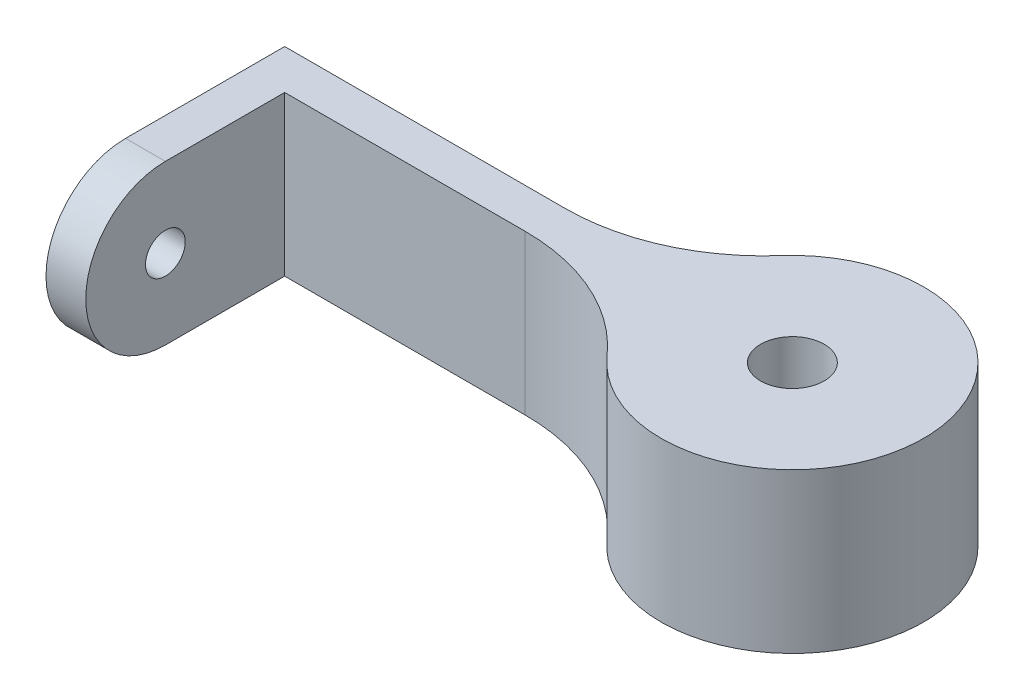
ISO-10303-21;
HEADER;
FILE_DESCRIPTION(('STEP AP214'),'2;1');
FILE_NAME('part.step','',(''),(''),'','','');
FILE_SCHEMA(('AUTOMOTIVE_DESIGN { 1 0 10303 214 1 1 1 1 }'));
ENDSEC;
DATA;
#1=APPLICATION_CONTEXT('core data for automotive mechanical design processes');
#2=APPLICATION_PROTOCOL_DEFINITION('international standard','automotive_design',2000,#1);
#3=PRODUCT_CONTEXT('',#1,'mechanical');
#4=PRODUCT('Part','Part','',(#3));
#5=PRODUCT_RELATED_PRODUCT_CATEGORY('part','',(#4));
#6=PRODUCT_DEFINITION_FORMATION('','',#4);
#7=PRODUCT_DEFINITION_CONTEXT('part definition',#1,'design');
#8=PRODUCT_DEFINITION('design','',#6,#7);
#9=PRODUCT_DEFINITION_SHAPE('','',#8);
#10=(LENGTH_UNIT() NAMED_UNIT(*) SI_UNIT(.MILLI.,.METRE.));
#11=(NAMED_UNIT(*) PLANE_ANGLE_UNIT() SI_UNIT($,.RADIAN.));
#12=(NAMED_UNIT(*) SI_UNIT($,.STERADIAN.) SOLID_ANGLE_UNIT());
#13=UNCERTAINTY_MEASURE_WITH_UNIT(LENGTH_MEASURE(1.E-05),#10,'distance_accuracy_value','');
#14=(GEOMETRIC_REPRESENTATION_CONTEXT(3) GLOBAL_UNCERTAINTY_ASSIGNED_CONTEXT((#13)) GLOBAL_UNIT_ASSIGNED_CONTEXT((#10,
#11,#12)) REPRESENTATION_CONTEXT('',''));
#15=CARTESIAN_POINT('',(0.,0.,0.));
#16=DIRECTION('',(0.,0.,1.));
#17=DIRECTION('',(1.,0.,0.));
#18=AXIS2_PLACEMENT_3D('',#15,#16,#17);
#19=CARTESIAN_POINT('',(-26.52380257212,8.,0.));
#20=DIRECTION('',(1.,0.,0.));
#21=DIRECTION('',(0.,0.,-1.));
#22=AXIS2_PLACEMENT_3D('',#19,#20,#21);
#23=PLANE('',#22);
#24=CARTESIAN_POINT('',(-26.52380257212,4.,7.));
#25=DIRECTION('',(-1.,0.,0.));
#26=DIRECTION('',(0.,0.,1.));
#27=AXIS2_PLACEMENT_3D('',#24,#25,#26);
#28=CIRCLE('',#27,1.);
#29=CARTESIAN_POINT('',(-26.52380257212,4.,8.));
#30=VERTEX_POINT('',#29);
#31=EDGE_CURVE('E192',#30,#30,#28,.T.);
#32=ORIENTED_EDGE('',*,*,#31,.F.);
#33=EDGE_LOOP('',(#32));
#34=FACE_BOUND('',#33,.T.);
#35=DIRECTION('',(0.,0.,1.));
#36=VECTOR('',#35,1.);
#37=CARTESIAN_POINT('',(-26.52380257212,0.,0.));
#38=LINE('',#37,#36);
#39=CARTESIAN_POINT('',(-26.52380257212,0.,-0.999999999999998));
#40=VERTEX_POINT('',#39);
#41=CARTESIAN_POINT('',(-26.52380257212,0.,7.));
#42=VERTEX_POINT('',#41);
#43=EDGE_CURVE('E198',#40,#42,#38,.T.);
#44=ORIENTED_EDGE('',*,*,#43,.T.);
#45=CARTESIAN_POINT('',(-26.52380257212,4.,7.));
#46=DIRECTION('',(-1.,0.,0.));
#47=DIRECTION('',(0.,0.,1.));
#48=AXIS2_PLACEMENT_3D('',#45,#46,#47);
#49=CIRCLE('',#48,4.);
#50=CARTESIAN_POINT('',(-26.52380257212,8.,7.));
#51=VERTEX_POINT('',#50);
#52=EDGE_CURVE('E180',#42,#51,#49,.T.);
#53=ORIENTED_EDGE('',*,*,#52,.T.);
#54=DIRECTION('',(0.,0.,1.));
#55=VECTOR('',#54,1.);
#56=CARTESIAN_POINT('',(-26.52380257212,8.,0.));
#57=LINE('',#56,#55);
#58=CARTESIAN_POINT('',(-26.52380257212,8.,-0.999999999999998));
#59=VERTEX_POINT('',#58);
#60=EDGE_CURVE('E264',#59,#51,#57,.T.);
#61=ORIENTED_EDGE('',*,*,#60,.F.);
#62=DIRECTION('',(0.,-1.,0.));
#63=VECTOR('',#62,1.);
#64=CARTESIAN_POINT('',(-26.52380257212,8.,-0.999999999999998));
#65=LINE('',#64,#63);
#66=EDGE_CURVE('E206',#59,#40,#65,.T.);
#67=ORIENTED_EDGE('',*,*,#66,.T.);
#68=EDGE_LOOP('',(#44,#53,#61,#67));
#69=FACE_BOUND('',#68,.T.);
#70=ADVANCED_FACE('F114',(#34,#69),#23,.F.);
#71=CARTESIAN_POINT('',(-24.52380257212,8.,1.));
#72=DIRECTION('',(1.,0.,0.));
#73=DIRECTION('',(0.,0.,-1.));
#74=AXIS2_PLACEMENT_3D('',#71,#72,#73);
#75=PLANE('',#74);
#76=CARTESIAN_POINT('',(-24.52380257212,4.,7.));
#77=DIRECTION('',(1.,0.,0.));
#78=DIRECTION('',(0.,0.,-1.));
#79=AXIS2_PLACEMENT_3D('',#76,#77,#78);
#80=CIRCLE('',#79,1.);
#81=CARTESIAN_POINT('',(-24.52380257212,4.,8.));
#82=VERTEX_POINT('',#81);
#83=EDGE_CURVE('E234',#82,#82,#80,.F.);
#84=ORIENTED_EDGE('',*,*,#83,.T.);
#85=EDGE_LOOP('',(#84));
#86=FACE_BOUND('',#85,.T.);
#87=CARTESIAN_POINT('',(-24.52380257212,4.,7.));
#88=DIRECTION('',(1.,0.,0.));
#89=DIRECTION('',(0.,0.,-1.));
#90=AXIS2_PLACEMENT_3D('',#87,#88,#89);
#91=CIRCLE('',#90,4.);
#92=CARTESIAN_POINT('',(-24.52380257212,0.,7.));
#93=VERTEX_POINT('',#92);
#94=CARTESIAN_POINT('',(-24.52380257212,8.,7.));
#95=VERTEX_POINT('',#94);
#96=EDGE_CURVE('E204',#93,#95,#91,.F.);
#97=ORIENTED_EDGE('',*,*,#96,.F.);
#98=DIRECTION('',(0.,0.,1.));
#99=VECTOR('',#98,1.);
#100=CARTESIAN_POINT('',(-24.52380257212,0.,1.));
#101=LINE('',#100,#99);
#102=CARTESIAN_POINT('',(-24.52380257212,0.,1.));
#103=VERTEX_POINT('',#102);
#104=EDGE_CURVE('E202',#103,#93,#101,.T.);
#105=ORIENTED_EDGE('',*,*,#104,.F.);
#106=DIRECTION('',(0.,-1.,0.));
#107=VECTOR('',#106,1.);
#108=CARTESIAN_POINT('',(-24.52380257212,8.,1.));
#109=LINE('',#108,#107);
#110=CARTESIAN_POINT('',(-24.52380257212,8.,1.));
#111=VERTEX_POINT('',#110);
#112=EDGE_CURVE('E222',#111,#103,#109,.T.);
#113=ORIENTED_EDGE('',*,*,#112,.F.);
#114=DIRECTION('',(0.,0.,1.));
#115=VECTOR('',#114,1.);
#116=CARTESIAN_POINT('',(-24.52380257212,8.,1.));
#117=LINE('',#116,#115);
#118=EDGE_CURVE('E227',#111,#95,#117,.T.);
#119=ORIENTED_EDGE('',*,*,#118,.T.);
#120=EDGE_LOOP('',(#97,#105,#113,#119));
#121=FACE_BOUND('',#120,.T.);
#122=ADVANCED_FACE('F298',(#86,#121),#75,.T.);
#123=CARTESIAN_POINT('',(0.,8.,0.));
#124=DIRECTION('',(0.,-1.,0.));
#125=DIRECTION('',(0.,0.,-1.));
#126=AXIS2_PLACEMENT_3D('',#123,#124,#125);
#127=CYLINDRICAL_SURFACE('',#126,6.6);
#128=CARTESIAN_POINT('',(0.,8.,0.));
#129=DIRECTION('',(0.,1.,0.));
#130=DIRECTION('',(0.,0.,1.));
#131=AXIS2_PLACEMENT_3D('',#128,#129,#130);
#132=CIRCLE('',#131,6.6);
#133=CARTESIAN_POINT('',(-4.94292933822999,8.,4.37349397590361));
#134=VERTEX_POINT('',#133);
#135=CARTESIAN_POINT('',(-4.94292933822999,8.,-4.37349397590361));
#136=VERTEX_POINT('',#135);
#137=EDGE_CURVE('E265',#134,#136,#132,.T.);
#138=ORIENTED_EDGE('',*,*,#137,.F.);
#139=DIRECTION('',(0.,-1.,0.));
#140=VECTOR('',#139,1.);
#141=CARTESIAN_POINT('',(-4.94292933822999,8.,4.37349397590361));
#142=LINE('',#141,#140);
#143=CARTESIAN_POINT('',(-4.94292933822999,0.,4.37349397590361));
#144=VERTEX_POINT('',#143);
#145=EDGE_CURVE('E237',#134,#144,#142,.T.);
#146=ORIENTED_EDGE('',*,*,#145,.T.);
#147=CARTESIAN_POINT('',(0.,0.,0.));
#148=DIRECTION('',(0.,1.,0.));
#149=DIRECTION('',(0.,0.,1.));
#150=AXIS2_PLACEMENT_3D('',#147,#148,#149);
#151=CIRCLE('',#150,6.6);
#152=CARTESIAN_POINT('',(-4.94292933822999,0.,-4.37349397590361));
#153=VERTEX_POINT('',#152);
#154=EDGE_CURVE('E216',#144,#153,#151,.T.);
#155=ORIENTED_EDGE('',*,*,#154,.T.);
#156=DIRECTION('',(0.,-1.,0.));
#157=VECTOR('',#156,1.);
#158=CARTESIAN_POINT('',(-4.94292933822999,8.,-4.37349397590361));
#159=LINE('',#158,#157);
#160=EDGE_CURVE('E226',#153,#136,#159,.F.);
#161=ORIENTED_EDGE('',*,*,#160,.T.);
#162=EDGE_LOOP('',(#138,#146,#155,#161));
#163=FACE_BOUND('',#162,.T.);
#164=ADVANCED_FACE('F257',(#163),#127,.T.);
#165=CARTESIAN_POINT('',(0.,8.,-0.999999999999998));
#166=DIRECTION('',(0.,0.,-1.));
#167=DIRECTION('',(-1.,0.,0.));
#168=AXIS2_PLACEMENT_3D('',#165,#166,#167);
#169=PLANE('',#168);
#170=DIRECTION('',(1.,0.,0.));
#171=VECTOR('',#170,1.);
#172=CARTESIAN_POINT('',(0.,8.,-0.999999999999998));
#173=LINE('',#172,#171);
#174=CARTESIAN_POINT('',(-12.432216214336,8.,-0.999999999999998));
#175=VERTEX_POINT('',#174);
#176=EDGE_CURVE('E262',#59,#175,#173,.T.);
#177=ORIENTED_EDGE('',*,*,#176,.T.);
#178=DIRECTION('',(0.,-1.,0.));
#179=VECTOR('',#178,1.);
#180=CARTESIAN_POINT('',(-12.432216214336,8.,-0.999999999999998));
#181=LINE('',#180,#179);
#182=CARTESIAN_POINT('',(-12.432216214336,0.,-0.999999999999998));
#183=VERTEX_POINT('',#182);
#184=EDGE_CURVE('E244',#175,#183,#181,.T.);
#185=ORIENTED_EDGE('',*,*,#184,.T.);
#186=DIRECTION('',(1.,0.,0.));
#187=VECTOR('',#186,1.);
#188=CARTESIAN_POINT('',(0.,0.,-0.999999999999998));
#189=LINE('',#188,#187);
#190=EDGE_CURVE('E209',#40,#183,#189,.T.);
#191=ORIENTED_EDGE('',*,*,#190,.F.);
#192=ORIENTED_EDGE('',*,*,#66,.F.);
#193=EDGE_LOOP('',(#177,#185,#191,#192));
#194=FACE_BOUND('',#193,.T.);
#195=ADVANCED_FACE('F261',(#194),#169,.T.);
#196=CARTESIAN_POINT('',(0.,8.,0.));
#197=DIRECTION('',(0.,-1.,0.));
#198=DIRECTION('',(0.,0.,-1.));
#199=AXIS2_PLACEMENT_3D('',#196,#197,#198);
#200=CYLINDRICAL_SURFACE('',#199,1.6);
#201=CARTESIAN_POINT('',(0.,8.,0.));
#202=DIRECTION('',(0.,1.,0.));
#203=DIRECTION('',(0.,0.,1.));
#204=AXIS2_PLACEMENT_3D('',#201,#202,#203);
#205=CIRCLE('',#204,1.6);
#206=CARTESIAN_POINT('',(0.,8.,1.6));
#207=VERTEX_POINT('',#206);
#208=EDGE_CURVE('E214',#207,#207,#205,.T.);
#209=ORIENTED_EDGE('',*,*,#208,.T.);
#210=EDGE_LOOP('',(#209));
#211=FACE_BOUND('',#210,.T.);
#212=CARTESIAN_POINT('',(0.,0.,0.));
#213=DIRECTION('',(0.,1.,0.));
#214=DIRECTION('',(0.,0.,1.));
#215=AXIS2_PLACEMENT_3D('',#212,#213,#214);
#216=CIRCLE('',#215,1.6);
#217=CARTESIAN_POINT('',(0.,0.,1.6));
#218=VERTEX_POINT('',#217);
#219=EDGE_CURVE('E231',#218,#218,#216,.T.);
#220=ORIENTED_EDGE('',*,*,#219,.F.);
#221=EDGE_LOOP('',(#220));
#222=FACE_BOUND('',#221,.T.);
#223=ADVANCED_FACE('F281',(#211,#222),#200,.F.);
#224=CARTESIAN_POINT('',(0.,8.,0.999999999999999));
#225=DIRECTION('',(0.,0.,-1.));
#226=DIRECTION('',(-1.,0.,0.));
#227=AXIS2_PLACEMENT_3D('',#224,#225,#226);
#228=PLANE('',#227);
#229=DIRECTION('',(1.,0.,0.));
#230=VECTOR('',#229,1.);
#231=CARTESIAN_POINT('',(0.,0.,0.999999999999999));
#232=LINE('',#231,#230);
#233=CARTESIAN_POINT('',(-12.432216214336,0.,1.));
#234=VERTEX_POINT('',#233);
#235=EDGE_CURVE('E208',#103,#234,#232,.T.);
#236=ORIENTED_EDGE('',*,*,#235,.T.);
#237=DIRECTION('',(0.,1.,0.));
#238=VECTOR('',#237,1.);
#239=CARTESIAN_POINT('',(-12.432216214336,8.,1.));
#240=LINE('',#239,#238);
#241=CARTESIAN_POINT('',(-12.432216214336,8.,1.));
#242=VERTEX_POINT('',#241);
#243=EDGE_CURVE('E241',#234,#242,#240,.T.);
#244=ORIENTED_EDGE('',*,*,#243,.T.);
#245=DIRECTION('',(1.,0.,0.));
#246=VECTOR('',#245,1.);
#247=CARTESIAN_POINT('',(0.,8.,0.999999999999999));
#248=LINE('',#247,#246);
#249=EDGE_CURVE('E223',#111,#242,#248,.T.);
#250=ORIENTED_EDGE('',*,*,#249,.F.);
#251=ORIENTED_EDGE('',*,*,#112,.T.);
#252=EDGE_LOOP('',(#236,#244,#250,#251));
#253=FACE_BOUND('',#252,.T.);
#254=ADVANCED_FACE('F283',(#253),#228,.F.);
#255=CARTESIAN_POINT('',(0.,8.,0.));
#256=DIRECTION('',(0.,1.,0.));
#257=DIRECTION('',(0.,0.,1.));
#258=AXIS2_PLACEMENT_3D('',#255,#256,#257);
#259=PLANE('',#258);
#260=DIRECTION('',(-1.,0.,0.));
#261=VECTOR('',#260,1.);
#262=CARTESIAN_POINT('',(-18.8669483226277,8.,7.));
#263=LINE('',#262,#261);
#264=EDGE_CURVE('E186',#95,#51,#263,.T.);
#265=ORIENTED_EDGE('',*,*,#264,.F.);
#266=ORIENTED_EDGE('',*,*,#118,.F.);
#267=ORIENTED_EDGE('',*,*,#249,.T.);
#268=CARTESIAN_POINT('',(-12.432216214336,8.,11.));
#269=DIRECTION('',(0.,1.,0.));
#270=DIRECTION('',(0.,0.,1.));
#271=AXIS2_PLACEMENT_3D('',#268,#269,#270);
#272=CIRCLE('',#271,10.);
#273=EDGE_CURVE('E250',#242,#134,#272,.F.);
#274=ORIENTED_EDGE('',*,*,#273,.T.);
#275=ORIENTED_EDGE('',*,*,#137,.T.);
#276=CARTESIAN_POINT('',(-12.432216214336,8.,-11.));
#277=DIRECTION('',(0.,1.,0.));
#278=DIRECTION('',(0.,0.,1.));
#279=AXIS2_PLACEMENT_3D('',#276,#277,#278);
#280=CIRCLE('',#279,10.);
#281=EDGE_CURVE('E12',#136,#175,#280,.F.);
#282=ORIENTED_EDGE('',*,*,#281,.T.);
#283=ORIENTED_EDGE('',*,*,#176,.F.);
#284=ORIENTED_EDGE('',*,*,#60,.T.);
#285=EDGE_LOOP('',(#265,#266,#267,#274,#275,#282,#283,#284));
#286=FACE_BOUND('',#285,.T.);
#287=ORIENTED_EDGE('',*,*,#208,.F.);
#288=EDGE_LOOP('',(#287));
#289=FACE_BOUND('',#288,.T.);
#290=ADVANCED_FACE('F290',(#286,#289),#259,.T.);
#291=CARTESIAN_POINT('',(0.,0.,0.));
#292=DIRECTION('',(0.,1.,0.));
#293=DIRECTION('',(0.,0.,1.));
#294=AXIS2_PLACEMENT_3D('',#291,#292,#293);
#295=PLANE('',#294);
#296=ORIENTED_EDGE('',*,*,#219,.T.);
#297=EDGE_LOOP('',(#296));
#298=FACE_BOUND('',#297,.T.);
#299=ORIENTED_EDGE('',*,*,#104,.T.);
#300=DIRECTION('',(-1.,0.,0.));
#301=VECTOR('',#300,1.);
#302=CARTESIAN_POINT('',(-18.8669483226277,0.,7.));
#303=LINE('',#302,#301);
#304=EDGE_CURVE('E183',#93,#42,#303,.T.);
#305=ORIENTED_EDGE('',*,*,#304,.T.);
#306=ORIENTED_EDGE('',*,*,#43,.F.);
#307=ORIENTED_EDGE('',*,*,#190,.T.);
#308=CARTESIAN_POINT('',(-12.432216214336,0.,-11.));
#309=DIRECTION('',(0.,1.,0.));
#310=DIRECTION('',(0.,0.,1.));
#311=AXIS2_PLACEMENT_3D('',#308,#309,#310);
#312=CIRCLE('',#311,10.);
#313=EDGE_CURVE('E123',#183,#153,#312,.T.);
#314=ORIENTED_EDGE('',*,*,#313,.T.);
#315=ORIENTED_EDGE('',*,*,#154,.F.);
#316=CARTESIAN_POINT('',(-12.432216214336,0.,11.));
#317=DIRECTION('',(0.,1.,0.));
#318=DIRECTION('',(0.,0.,1.));
#319=AXIS2_PLACEMENT_3D('',#316,#317,#318);
#320=CIRCLE('',#319,10.);
#321=EDGE_CURVE('E247',#144,#234,#320,.T.);
#322=ORIENTED_EDGE('',*,*,#321,.T.);
#323=ORIENTED_EDGE('',*,*,#235,.F.);
#324=EDGE_LOOP('',(#299,#305,#306,#307,#314,#315,#322,#323));
#325=FACE_BOUND('',#324,.T.);
#326=ADVANCED_FACE('F196',(#298,#325),#295,.F.);
#327=CARTESIAN_POINT('',(-12.432216214336,8.,11.));
#328=DIRECTION('',(0.,-1.,0.));
#329=DIRECTION('',(0.,0.,-1.));
#330=AXIS2_PLACEMENT_3D('',#327,#328,#329);
#331=CYLINDRICAL_SURFACE('',#330,10.);
#332=ORIENTED_EDGE('',*,*,#273,.F.);
#333=ORIENTED_EDGE('',*,*,#243,.F.);
#334=ORIENTED_EDGE('',*,*,#321,.F.);
#335=ORIENTED_EDGE('',*,*,#145,.F.);
#336=EDGE_LOOP('',(#332,#333,#334,#335));
#337=FACE_BOUND('',#336,.T.);
#338=ADVANCED_FACE('F332',(#337),#331,.F.);
#339=CARTESIAN_POINT('',(-12.432216214336,8.,-11.));
#340=DIRECTION('',(0.,-1.,0.));
#341=DIRECTION('',(0.,0.,-1.));
#342=AXIS2_PLACEMENT_3D('',#339,#340,#341);
#343=CYLINDRICAL_SURFACE('',#342,10.);
#344=ORIENTED_EDGE('',*,*,#281,.F.);
#345=ORIENTED_EDGE('',*,*,#160,.F.);
#346=ORIENTED_EDGE('',*,*,#313,.F.);
#347=ORIENTED_EDGE('',*,*,#184,.F.);
#348=EDGE_LOOP('',(#344,#345,#346,#347));
#349=FACE_BOUND('',#348,.T.);
#350=ADVANCED_FACE('F116',(#349),#343,.F.);
#351=CARTESIAN_POINT('',(-18.8669483226277,4.,7.));
#352=DIRECTION('',(-1.,0.,0.));
#353=DIRECTION('',(0.,0.,1.));
#354=AXIS2_PLACEMENT_3D('',#351,#352,#353);
#355=CYLINDRICAL_SURFACE('',#354,4.);
#356=ORIENTED_EDGE('',*,*,#96,.T.);
#357=ORIENTED_EDGE('',*,*,#264,.T.);
#358=ORIENTED_EDGE('',*,*,#52,.F.);
#359=ORIENTED_EDGE('',*,*,#304,.F.);
#360=EDGE_LOOP('',(#356,#357,#358,#359));
#361=FACE_BOUND('',#360,.T.);
#362=ADVANCED_FACE('F182',(#361),#355,.T.);
#363=CARTESIAN_POINT('',(-18.8669483226277,4.,7.));
#364=DIRECTION('',(-1.,0.,0.));
#365=DIRECTION('',(0.,0.,1.));
#366=AXIS2_PLACEMENT_3D('',#363,#364,#365);
#367=CYLINDRICAL_SURFACE('',#366,1.);
#368=CARTESIAN_POINT('',(-26.52380257212,4.,8.));
#369=CARTESIAN_POINT('',(-26.5029692387867,4.,8.));
#370=CARTESIAN_POINT('',(-26.4821359054534,4.,8.));
#371=CARTESIAN_POINT('',(-26.4404692387867,4.,8.));
#372=CARTESIAN_POINT('',(-26.4196359054534,4.,8.));
#373=CARTESIAN_POINT('',(-26.3779692387867,4.,8.));
#374=CARTESIAN_POINT('',(-26.3571359054534,4.,8.));
#375=CARTESIAN_POINT('',(-26.3154692387867,4.,8.));
#376=CARTESIAN_POINT('',(-26.2946359054534,4.,8.));
#377=CARTESIAN_POINT('',(-26.2529692387867,4.,8.));
#378=CARTESIAN_POINT('',(-26.2321359054534,4.,8.));
#379=CARTESIAN_POINT('',(-26.1904692387867,4.,8.));
#380=CARTESIAN_POINT('',(-26.1696359054534,4.,8.));
#381=CARTESIAN_POINT('',(-26.1279692387867,4.,8.));
#382=CARTESIAN_POINT('',(-26.1071359054534,4.,8.));
#383=CARTESIAN_POINT('',(-26.0654692387867,4.,8.));
#384=CARTESIAN_POINT('',(-26.0446359054534,4.,8.));
#385=CARTESIAN_POINT('',(-26.0029692387867,4.,8.));
#386=CARTESIAN_POINT('',(-25.9821359054534,4.,8.));
#387=CARTESIAN_POINT('',(-25.9404692387867,4.,8.));
#388=CARTESIAN_POINT('',(-25.9196359054534,4.,8.));
#389=CARTESIAN_POINT('',(-25.8779692387867,4.,8.));
#390=CARTESIAN_POINT('',(-25.8571359054534,4.,8.));
#391=CARTESIAN_POINT('',(-25.8154692387867,4.,8.));
#392=CARTESIAN_POINT('',(-25.7946359054534,4.,8.));
#393=CARTESIAN_POINT('',(-25.7529692387867,4.,8.));
#394=CARTESIAN_POINT('',(-25.7321359054534,4.,8.));
#395=CARTESIAN_POINT('',(-25.6904692387867,4.,8.));
#396=CARTESIAN_POINT('',(-25.6696359054534,4.,8.));
#397=CARTESIAN_POINT('',(-25.6279692387867,4.,8.));
#398=CARTESIAN_POINT('',(-25.6071359054534,4.,8.));
#399=CARTESIAN_POINT('',(-25.5654692387867,4.,8.));
#400=CARTESIAN_POINT('',(-25.5446359054534,4.,8.));
#401=CARTESIAN_POINT('',(-25.5029692387867,4.,8.));
#402=CARTESIAN_POINT('',(-25.4821359054534,4.,8.));
#403=CARTESIAN_POINT('',(-25.4404692387867,4.,8.));
#404=CARTESIAN_POINT('',(-25.4196359054534,4.,8.));
#405=CARTESIAN_POINT('',(-25.3779692387867,4.,8.));
#406=CARTESIAN_POINT('',(-25.3571359054534,4.,8.));
#407=CARTESIAN_POINT('',(-25.3154692387867,4.,8.));
#408=CARTESIAN_POINT('',(-25.2946359054534,4.,8.));
#409=CARTESIAN_POINT('',(-25.2529692387867,4.,8.));
#410=CARTESIAN_POINT('',(-25.2321359054534,4.,8.));
#411=CARTESIAN_POINT('',(-25.1904692387867,4.,8.));
#412=CARTESIAN_POINT('',(-25.1696359054534,4.,8.));
#413=CARTESIAN_POINT('',(-25.1279692387867,4.,8.));
#414=CARTESIAN_POINT('',(-25.1071359054534,4.,8.));
#415=CARTESIAN_POINT('',(-25.0654692387867,4.,8.));
#416=CARTESIAN_POINT('',(-25.0446359054534,4.,8.));
#417=CARTESIAN_POINT('',(-25.0029692387867,4.,8.));
#418=CARTESIAN_POINT('',(-24.9821359054534,4.,8.));
#419=CARTESIAN_POINT('',(-24.9404692387867,4.,8.));
#420=CARTESIAN_POINT('',(-24.9196359054534,4.,8.));
#421=CARTESIAN_POINT('',(-24.8779692387867,4.,8.));
#422=CARTESIAN_POINT('',(-24.8571359054534,4.,8.));
#423=CARTESIAN_POINT('',(-24.8154692387867,4.,8.));
#424=CARTESIAN_POINT('',(-24.7946359054534,4.,8.));
#425=CARTESIAN_POINT('',(-24.7529692387867,4.,8.));
#426=CARTESIAN_POINT('',(-24.7321359054534,4.,8.));
#427=CARTESIAN_POINT('',(-24.6904692387867,4.,8.));
#428=CARTESIAN_POINT('',(-24.6696359054534,4.,8.));
#429=CARTESIAN_POINT('',(-24.6279692387867,4.,8.));
#430=CARTESIAN_POINT('',(-24.6071359054534,4.,8.));
#431=CARTESIAN_POINT('',(-24.5654692387867,4.,8.));
#432=CARTESIAN_POINT('',(-24.5446359054534,4.,8.));
#433=CARTESIAN_POINT('',(-24.52380257212,4.,8.));
#434=B_SPLINE_CURVE_WITH_KNOTS('',3,(#368,#369,#370,#371,#372,#373,#374,#375,#376,#377,#378,
#379,#380,#381,#382,#383,#384,#385,#386,#387,#388,#389,#390,#391,#392,#393,#394,#395,#396,#397,
#398,#399,#400,#401,#402,#403,#404,#405,#406,#407,#408,#409,#410,#411,#412,#413,#414,#415,#416,
#417,#418,#419,#420,#421,#422,#423,#424,#425,#426,#427,#428,#429,#430,#431,#432,#433),
.UNSPECIFIED.,.F.,.F.,(4,2,2,2,2,2,2,2,2,2,2,2,2,2,2,2,2,2,2,2,2,2,2,2,2,2,2,2,2,2,2,2,4),(0.,
0.0625000000000001,0.125,0.187499999999997,0.249999999999997,0.312499999999997,
0.374999999999997,0.437499999999997,0.499999999999997,0.562499999999997,0.624999999999997,
0.687499999999997,0.749999999999997,0.812499999999997,0.874999999999997,0.937499999999997,
0.999999999999997,1.0625,1.125,1.1875,1.25,1.3125,1.375,1.4375,1.5,1.5625,1.625,1.6875,1.75,
1.81249999999999,1.87499999999999,1.93749999999999,1.99999999999999),.UNSPECIFIED.);
#435=EDGE_CURVE('BSEAM380',#30,#82,#434,.T.);
#436=ORIENTED_EDGE('',*,*,#31,.T.);
#437=ORIENTED_EDGE('',*,*,#83,.F.);
#438=ORIENTED_EDGE('',*,*,#435,.T.);
#439=ORIENTED_EDGE('',*,*,#435,.F.);
#440=EDGE_LOOP('',(#436,#438,#437,#439));
#441=FACE_BOUND('',#440,.T.);
#442=ADVANCED_FACE('F380',(#441),#367,.F.);
#443=CLOSED_SHELL('',(#70,#122,#164,#195,#223,#254,#290,#326,#338,#350,#362,#442));
#444=MANIFOLD_SOLID_BREP('B2',#443);
#445=ADVANCED_BREP_SHAPE_REPRESENTATION('',(#18,#444),#14);
#446=SHAPE_DEFINITION_REPRESENTATION(#9,#445);
ENDSEC;
END-ISO-10303-21;
